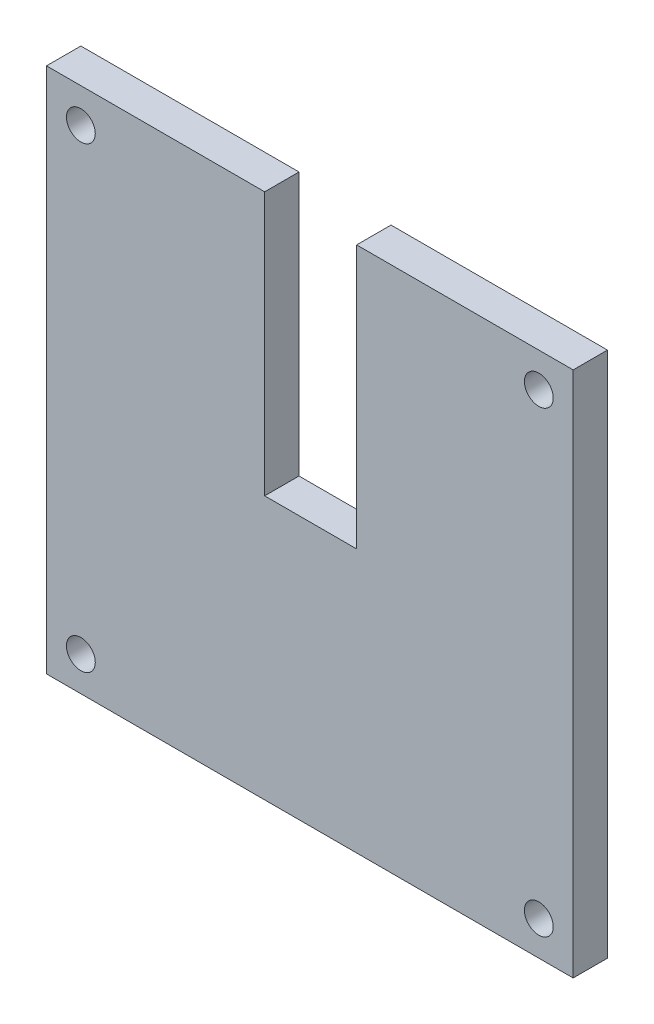
ISO-10303-21;
HEADER;
FILE_DESCRIPTION(('STEP AP214'),'2;1');
FILE_NAME('part.step','',(''),(''),'','','');
FILE_SCHEMA(('AUTOMOTIVE_DESIGN { 1 0 10303 214 1 1 1 1 }'));
ENDSEC;
DATA;
#1=APPLICATION_CONTEXT('core data for automotive mechanical design processes');
#2=APPLICATION_PROTOCOL_DEFINITION('international standard','automotive_design',2000,#1);
#3=PRODUCT_CONTEXT('',#1,'mechanical');
#4=PRODUCT('Part','Part','',(#3));
#5=PRODUCT_RELATED_PRODUCT_CATEGORY('part','',(#4));
#6=PRODUCT_DEFINITION_FORMATION('','',#4);
#7=PRODUCT_DEFINITION_CONTEXT('part definition',#1,'design');
#8=PRODUCT_DEFINITION('design','',#6,#7);
#9=PRODUCT_DEFINITION_SHAPE('','',#8);
#10=(LENGTH_UNIT() NAMED_UNIT(*) SI_UNIT(.MILLI.,.METRE.));
#11=(NAMED_UNIT(*) PLANE_ANGLE_UNIT() SI_UNIT($,.RADIAN.));
#12=(NAMED_UNIT(*) SI_UNIT($,.STERADIAN.) SOLID_ANGLE_UNIT());
#13=UNCERTAINTY_MEASURE_WITH_UNIT(LENGTH_MEASURE(1.E-05),#10,'distance_accuracy_value','');
#14=(GEOMETRIC_REPRESENTATION_CONTEXT(3) GLOBAL_UNCERTAINTY_ASSIGNED_CONTEXT((#13)) GLOBAL_UNIT_ASSIGNED_CONTEXT((#10,
#11,#12)) REPRESENTATION_CONTEXT('',''));
#15=CARTESIAN_POINT('',(0.,0.,0.));
#16=DIRECTION('',(0.,0.,1.));
#17=DIRECTION('',(1.,0.,0.));
#18=AXIS2_PLACEMENT_3D('',#15,#16,#17);
#19=CARTESIAN_POINT('',(29.21,29.21,3.81));
#20=DIRECTION('',(0.,-1.,0.));
#21=DIRECTION('',(1.,0.,0.));
#22=AXIS2_PLACEMENT_3D('',#19,#20,#21);
#23=PLANE('',#22);
#24=DIRECTION('',(-1.,0.,0.));
#25=VECTOR('',#24,1.);
#26=CARTESIAN_POINT('',(29.21,29.21,3.81));
#27=LINE('',#26,#25);
#28=CARTESIAN_POINT('',(-5.0091802723957,29.21,3.81));
#29=VERTEX_POINT('',#28);
#30=CARTESIAN_POINT('',(-29.21,29.21,3.81));
#31=VERTEX_POINT('',#30);
#32=EDGE_CURVE('E67',#29,#31,#27,.T.);
#33=ORIENTED_EDGE('',*,*,#32,.F.);
#34=DIRECTION('',(0.,0.,1.));
#35=VECTOR('',#34,1.);
#36=CARTESIAN_POINT('',(-5.0091802723957,29.21,0.));
#37=LINE('',#36,#35);
#38=CARTESIAN_POINT('',(-5.0091802723957,29.21,0.));
#39=VERTEX_POINT('',#38);
#40=EDGE_CURVE('E144',#39,#29,#37,.T.);
#41=ORIENTED_EDGE('',*,*,#40,.F.);
#42=DIRECTION('',(-1.,0.,0.));
#43=VECTOR('',#42,1.);
#44=CARTESIAN_POINT('',(29.21,29.21,0.));
#45=LINE('',#44,#43);
#46=CARTESIAN_POINT('',(-29.21,29.21,0.));
#47=VERTEX_POINT('',#46);
#48=EDGE_CURVE('E89',#39,#47,#45,.T.);
#49=ORIENTED_EDGE('',*,*,#48,.T.);
#50=DIRECTION('',(0.,0.,-1.));
#51=VECTOR('',#50,1.);
#52=CARTESIAN_POINT('',(-29.21,29.21,3.81));
#53=LINE('',#52,#51);
#54=EDGE_CURVE('E184',#31,#47,#53,.T.);
#55=ORIENTED_EDGE('',*,*,#54,.F.);
#56=EDGE_LOOP('',(#33,#41,#49,#55));
#57=FACE_BOUND('',#56,.T.);
#58=ADVANCED_FACE('F43',(#57),#23,.F.);
#59=CARTESIAN_POINT('',(-29.21,29.21,3.81));
#60=DIRECTION('',(1.,0.,0.));
#61=DIRECTION('',(0.,1.,0.));
#62=AXIS2_PLACEMENT_3D('',#59,#60,#61);
#63=PLANE('',#62);
#64=DIRECTION('',(0.,-1.,0.));
#65=VECTOR('',#64,1.);
#66=CARTESIAN_POINT('',(-29.21,29.21,0.));
#67=LINE('',#66,#65);
#68=CARTESIAN_POINT('',(-29.21,-29.21,0.));
#69=VERTEX_POINT('',#68);
#70=EDGE_CURVE('E172',#47,#69,#67,.T.);
#71=ORIENTED_EDGE('',*,*,#70,.T.);
#72=DIRECTION('',(0.,0.,-1.));
#73=VECTOR('',#72,1.);
#74=CARTESIAN_POINT('',(-29.21,-29.21,3.81));
#75=LINE('',#74,#73);
#76=CARTESIAN_POINT('',(-29.21,-29.21,3.81));
#77=VERTEX_POINT('',#76);
#78=EDGE_CURVE('E11',#77,#69,#75,.T.);
#79=ORIENTED_EDGE('',*,*,#78,.F.);
#80=DIRECTION('',(0.,-1.,0.));
#81=VECTOR('',#80,1.);
#82=CARTESIAN_POINT('',(-29.21,29.21,3.81));
#83=LINE('',#82,#81);
#84=EDGE_CURVE('E175',#31,#77,#83,.T.);
#85=ORIENTED_EDGE('',*,*,#84,.F.);
#86=ORIENTED_EDGE('',*,*,#54,.T.);
#87=EDGE_LOOP('',(#71,#79,#85,#86));
#88=FACE_BOUND('',#87,.T.);
#89=ADVANCED_FACE('F45',(#88),#63,.F.);
#90=CARTESIAN_POINT('',(29.21,-29.21,3.81));
#91=DIRECTION('',(0.,1.,0.));
#92=DIRECTION('',(0.,0.,1.));
#93=AXIS2_PLACEMENT_3D('',#90,#91,#92);
#94=PLANE('',#93);
#95=DIRECTION('',(1.,0.,0.));
#96=VECTOR('',#95,1.);
#97=CARTESIAN_POINT('',(29.21,-29.21,0.));
#98=LINE('',#97,#96);
#99=CARTESIAN_POINT('',(29.21,-29.21,0.));
#100=VERTEX_POINT('',#99);
#101=EDGE_CURVE('E187',#69,#100,#98,.T.);
#102=ORIENTED_EDGE('',*,*,#101,.T.);
#103=DIRECTION('',(0.,0.,-1.));
#104=VECTOR('',#103,1.);
#105=CARTESIAN_POINT('',(29.21,-29.21,3.81));
#106=LINE('',#105,#104);
#107=CARTESIAN_POINT('',(29.21,-29.21,3.81));
#108=VERTEX_POINT('',#107);
#109=EDGE_CURVE('E51',#108,#100,#106,.T.);
#110=ORIENTED_EDGE('',*,*,#109,.F.);
#111=DIRECTION('',(1.,0.,0.));
#112=VECTOR('',#111,1.);
#113=CARTESIAN_POINT('',(29.21,-29.21,3.81));
#114=LINE('',#113,#112);
#115=EDGE_CURVE('E96',#77,#108,#114,.T.);
#116=ORIENTED_EDGE('',*,*,#115,.F.);
#117=ORIENTED_EDGE('',*,*,#78,.T.);
#118=EDGE_LOOP('',(#102,#110,#116,#117));
#119=FACE_BOUND('',#118,.T.);
#120=ADVANCED_FACE('F211',(#119),#94,.F.);
#121=CARTESIAN_POINT('',(29.21,29.21,3.81));
#122=DIRECTION('',(-1.,0.,0.));
#123=DIRECTION('',(0.,-1.,0.));
#124=AXIS2_PLACEMENT_3D('',#121,#122,#123);
#125=PLANE('',#124);
#126=DIRECTION('',(0.,1.,0.));
#127=VECTOR('',#126,1.);
#128=CARTESIAN_POINT('',(29.21,29.21,0.));
#129=LINE('',#128,#127);
#130=CARTESIAN_POINT('',(29.21,29.21,0.));
#131=VERTEX_POINT('',#130);
#132=EDGE_CURVE('E189',#100,#131,#129,.T.);
#133=ORIENTED_EDGE('',*,*,#132,.T.);
#134=DIRECTION('',(0.,0.,-1.));
#135=VECTOR('',#134,1.);
#136=CARTESIAN_POINT('',(29.21,29.21,3.81));
#137=LINE('',#136,#135);
#138=CARTESIAN_POINT('',(29.21,29.21,3.81));
#139=VERTEX_POINT('',#138);
#140=EDGE_CURVE('E194',#139,#131,#137,.T.);
#141=ORIENTED_EDGE('',*,*,#140,.F.);
#142=DIRECTION('',(0.,1.,0.));
#143=VECTOR('',#142,1.);
#144=CARTESIAN_POINT('',(29.21,29.21,3.81));
#145=LINE('',#144,#143);
#146=EDGE_CURVE('E179',#108,#139,#145,.T.);
#147=ORIENTED_EDGE('',*,*,#146,.F.);
#148=ORIENTED_EDGE('',*,*,#109,.T.);
#149=EDGE_LOOP('',(#133,#141,#147,#148));
#150=FACE_BOUND('',#149,.T.);
#151=ADVANCED_FACE('F200',(#150),#125,.F.);
#152=CARTESIAN_POINT('',(5.19300340165794,29.21,0.));
#153=VERTEX_POINT('',#152);
#154=EDGE_CURVE('E177',#131,#153,#45,.T.);
#155=ORIENTED_EDGE('',*,*,#154,.T.);
#156=DIRECTION('',(0.,0.,1.));
#157=VECTOR('',#156,1.);
#158=CARTESIAN_POINT('',(5.19300340165794,29.21,0.));
#159=LINE('',#158,#157);
#160=CARTESIAN_POINT('',(5.19300340165794,29.21,3.81));
#161=VERTEX_POINT('',#160);
#162=EDGE_CURVE('E147',#153,#161,#159,.T.);
#163=ORIENTED_EDGE('',*,*,#162,.T.);
#164=EDGE_CURVE('E181',#139,#161,#27,.T.);
#165=ORIENTED_EDGE('',*,*,#164,.F.);
#166=ORIENTED_EDGE('',*,*,#140,.T.);
#167=EDGE_LOOP('',(#155,#163,#165,#166));
#168=FACE_BOUND('',#167,.T.);
#169=ADVANCED_FACE('F204',(#168),#23,.F.);
#170=CARTESIAN_POINT('',(0.,0.,3.81));
#171=DIRECTION('',(0.,0.,-1.));
#172=DIRECTION('',(-1.,0.,0.));
#173=AXIS2_PLACEMENT_3D('',#170,#171,#172);
#174=PLANE('',#173);
#175=CARTESIAN_POINT('',(25.4000006170508,25.4000006170507,3.81));
#176=DIRECTION('',(0.,0.,1.));
#177=DIRECTION('',(1.,0.,0.));
#178=AXIS2_PLACEMENT_3D('',#175,#176,#177);
#179=CIRCLE('',#178,1.6);
#180=CARTESIAN_POINT('',(27.0000006170508,25.4000006170507,3.81));
#181=VERTEX_POINT('',#180);
#182=EDGE_CURVE('E157',#181,#181,#179,.T.);
#183=ORIENTED_EDGE('',*,*,#182,.F.);
#184=EDGE_LOOP('',(#183));
#185=FACE_BOUND('',#184,.T.);
#186=CARTESIAN_POINT('',(-25.4000006170507,-25.4000006170507,3.81));
#187=DIRECTION('',(0.,0.,1.));
#188=DIRECTION('',(1.,0.,0.));
#189=AXIS2_PLACEMENT_3D('',#186,#187,#188);
#190=CIRCLE('',#189,1.6);
#191=CARTESIAN_POINT('',(-23.8000006170507,-25.4000006170507,3.81));
#192=VERTEX_POINT('',#191);
#193=EDGE_CURVE('E164',#192,#192,#190,.T.);
#194=ORIENTED_EDGE('',*,*,#193,.F.);
#195=EDGE_LOOP('',(#194));
#196=FACE_BOUND('',#195,.T.);
#197=CARTESIAN_POINT('',(25.4000006170507,-25.4000006170507,3.81));
#198=DIRECTION('',(0.,0.,1.));
#199=DIRECTION('',(1.,0.,0.));
#200=AXIS2_PLACEMENT_3D('',#197,#198,#199);
#201=CIRCLE('',#200,1.6);
#202=CARTESIAN_POINT('',(27.0000006170507,-25.4000006170507,3.81));
#203=VERTEX_POINT('',#202);
#204=EDGE_CURVE('E151',#203,#203,#201,.T.);
#205=ORIENTED_EDGE('',*,*,#204,.F.);
#206=EDGE_LOOP('',(#205));
#207=FACE_BOUND('',#206,.T.);
#208=CARTESIAN_POINT('',(-25.4000006170507,25.4000006170507,3.81));
#209=DIRECTION('',(0.,0.,1.));
#210=DIRECTION('',(1.,0.,0.));
#211=AXIS2_PLACEMENT_3D('',#208,#209,#210);
#212=CIRCLE('',#211,1.5999968);
#213=CARTESIAN_POINT('',(-23.8000038170507,25.4000006170507,3.81));
#214=VERTEX_POINT('',#213);
#215=EDGE_CURVE('E160',#214,#214,#212,.T.);
#216=ORIENTED_EDGE('',*,*,#215,.F.);
#217=EDGE_LOOP('',(#216));
#218=FACE_BOUND('',#217,.T.);
#219=DIRECTION('',(1.,0.,0.));
#220=VECTOR('',#219,1.);
#221=CARTESIAN_POINT('',(-5.00918027239569,0.,3.81));
#222=LINE('',#221,#220);
#223=CARTESIAN_POINT('',(-5.00918027239569,0.,3.81));
#224=VERTEX_POINT('',#223);
#225=CARTESIAN_POINT('',(5.19300340165794,0.,3.81));
#226=VERTEX_POINT('',#225);
#227=EDGE_CURVE('E138',#224,#226,#222,.T.);
#228=ORIENTED_EDGE('',*,*,#227,.F.);
#229=DIRECTION('',(0.,-1.,0.));
#230=VECTOR('',#229,1.);
#231=CARTESIAN_POINT('',(-5.0091802723957,29.21,3.81));
#232=LINE('',#231,#230);
#233=EDGE_CURVE('E122',#29,#224,#232,.T.);
#234=ORIENTED_EDGE('',*,*,#233,.F.);
#235=ORIENTED_EDGE('',*,*,#32,.T.);
#236=ORIENTED_EDGE('',*,*,#84,.T.);
#237=ORIENTED_EDGE('',*,*,#115,.T.);
#238=ORIENTED_EDGE('',*,*,#146,.T.);
#239=ORIENTED_EDGE('',*,*,#164,.T.);
#240=DIRECTION('',(0.,1.,0.));
#241=VECTOR('',#240,1.);
#242=CARTESIAN_POINT('',(5.19300340165794,29.21,3.81));
#243=LINE('',#242,#241);
#244=EDGE_CURVE('E136',#226,#161,#243,.T.);
#245=ORIENTED_EDGE('',*,*,#244,.F.);
#246=EDGE_LOOP('',(#228,#234,#235,#236,#237,#238,#239,#245));
#247=FACE_BOUND('',#246,.T.);
#248=ADVANCED_FACE('F207',(#185,#196,#207,#218,#247),#174,.F.);
#249=CARTESIAN_POINT('',(0.,0.,0.));
#250=DIRECTION('',(0.,0.,-1.));
#251=DIRECTION('',(-1.,0.,0.));
#252=AXIS2_PLACEMENT_3D('',#249,#250,#251);
#253=PLANE('',#252);
#254=DIRECTION('',(0.,-1.,0.));
#255=VECTOR('',#254,1.);
#256=CARTESIAN_POINT('',(-5.0091802723957,29.21,0.));
#257=LINE('',#256,#255);
#258=CARTESIAN_POINT('',(-5.00918027239569,0.,0.));
#259=VERTEX_POINT('',#258);
#260=EDGE_CURVE('E121',#39,#259,#257,.T.);
#261=ORIENTED_EDGE('',*,*,#260,.T.);
#262=DIRECTION('',(1.,0.,0.));
#263=VECTOR('',#262,1.);
#264=CARTESIAN_POINT('',(-5.00918027239569,0.,0.));
#265=LINE('',#264,#263);
#266=CARTESIAN_POINT('',(5.19300340165794,0.,0.));
#267=VERTEX_POINT('',#266);
#268=EDGE_CURVE('E129',#259,#267,#265,.T.);
#269=ORIENTED_EDGE('',*,*,#268,.T.);
#270=DIRECTION('',(0.,1.,0.));
#271=VECTOR('',#270,1.);
#272=CARTESIAN_POINT('',(5.19300340165794,29.21,0.));
#273=LINE('',#272,#271);
#274=EDGE_CURVE('E58',#267,#153,#273,.T.);
#275=ORIENTED_EDGE('',*,*,#274,.T.);
#276=ORIENTED_EDGE('',*,*,#154,.F.);
#277=ORIENTED_EDGE('',*,*,#132,.F.);
#278=ORIENTED_EDGE('',*,*,#101,.F.);
#279=ORIENTED_EDGE('',*,*,#70,.F.);
#280=ORIENTED_EDGE('',*,*,#48,.F.);
#281=EDGE_LOOP('',(#261,#269,#275,#276,#277,#278,#279,#280));
#282=FACE_BOUND('',#281,.T.);
#283=CARTESIAN_POINT('',(25.4000006170508,25.4000006170507,0.));
#284=DIRECTION('',(0.,0.,1.));
#285=DIRECTION('',(1.,0.,0.));
#286=AXIS2_PLACEMENT_3D('',#283,#284,#285);
#287=CIRCLE('',#286,1.6);
#288=CARTESIAN_POINT('',(27.0000006170508,25.4000006170507,0.));
#289=VERTEX_POINT('',#288);
#290=EDGE_CURVE('E161',#289,#289,#287,.T.);
#291=ORIENTED_EDGE('',*,*,#290,.T.);
#292=EDGE_LOOP('',(#291));
#293=FACE_BOUND('',#292,.T.);
#294=CARTESIAN_POINT('',(-25.4000006170507,-25.4000006170507,0.));
#295=DIRECTION('',(0.,0.,1.));
#296=DIRECTION('',(1.,0.,0.));
#297=AXIS2_PLACEMENT_3D('',#294,#295,#296);
#298=CIRCLE('',#297,1.6);
#299=CARTESIAN_POINT('',(-23.8000006170507,-25.4000006170507,0.));
#300=VERTEX_POINT('',#299);
#301=EDGE_CURVE('E154',#300,#300,#298,.T.);
#302=ORIENTED_EDGE('',*,*,#301,.T.);
#303=EDGE_LOOP('',(#302));
#304=FACE_BOUND('',#303,.T.);
#305=CARTESIAN_POINT('',(25.4000006170507,-25.4000006170507,0.));
#306=DIRECTION('',(0.,0.,1.));
#307=DIRECTION('',(1.,0.,0.));
#308=AXIS2_PLACEMENT_3D('',#305,#306,#307);
#309=CIRCLE('',#308,1.6);
#310=CARTESIAN_POINT('',(27.0000006170507,-25.4000006170507,0.));
#311=VERTEX_POINT('',#310);
#312=EDGE_CURVE('E146',#311,#311,#309,.T.);
#313=ORIENTED_EDGE('',*,*,#312,.T.);
#314=EDGE_LOOP('',(#313));
#315=FACE_BOUND('',#314,.T.);
#316=CARTESIAN_POINT('',(-25.4000006170507,25.4000006170507,0.));
#317=DIRECTION('',(0.,0.,1.));
#318=DIRECTION('',(1.,0.,0.));
#319=AXIS2_PLACEMENT_3D('',#316,#317,#318);
#320=CIRCLE('',#319,1.5999968);
#321=CARTESIAN_POINT('',(-23.8000038170507,25.4000006170507,0.));
#322=VERTEX_POINT('',#321);
#323=EDGE_CURVE('E169',#322,#322,#320,.T.);
#324=ORIENTED_EDGE('',*,*,#323,.T.);
#325=EDGE_LOOP('',(#324));
#326=FACE_BOUND('',#325,.T.);
#327=ADVANCED_FACE('F133',(#282,#293,#304,#315,#326),#253,.T.);
#328=CARTESIAN_POINT('',(-25.4000006170507,25.4000006170507,0.));
#329=DIRECTION('',(0.,0.,1.));
#330=DIRECTION('',(1.,0.,0.));
#331=AXIS2_PLACEMENT_3D('',#328,#329,#330);
#332=CYLINDRICAL_SURFACE('',#331,1.5999968);
#333=CARTESIAN_POINT('',(-23.8000038170507,25.4000006170507,0.));
#334=CARTESIAN_POINT('',(-23.8000038170507,25.4000006170507,0.0396874999999999));
#335=CARTESIAN_POINT('',(-23.8000038170507,25.4000006170507,0.079375));
#336=CARTESIAN_POINT('',(-23.8000038170507,25.4000006170507,0.15875));
#337=CARTESIAN_POINT('',(-23.8000038170507,25.4000006170507,0.1984375));
#338=CARTESIAN_POINT('',(-23.8000038170507,25.4000006170507,0.2778125));
#339=CARTESIAN_POINT('',(-23.8000038170507,25.4000006170507,0.3175));
#340=CARTESIAN_POINT('',(-23.8000038170507,25.4000006170507,0.396875));
#341=CARTESIAN_POINT('',(-23.8000038170507,25.4000006170507,0.4365625));
#342=CARTESIAN_POINT('',(-23.8000038170507,25.4000006170507,0.5159375));
#343=CARTESIAN_POINT('',(-23.8000038170507,25.4000006170507,0.555625));
#344=CARTESIAN_POINT('',(-23.8000038170507,25.4000006170507,0.635));
#345=CARTESIAN_POINT('',(-23.8000038170507,25.4000006170507,0.6746875));
#346=CARTESIAN_POINT('',(-23.8000038170507,25.4000006170507,0.7540625));
#347=CARTESIAN_POINT('',(-23.8000038170507,25.4000006170507,0.79375));
#348=CARTESIAN_POINT('',(-23.8000038170507,25.4000006170507,0.873125));
#349=CARTESIAN_POINT('',(-23.8000038170507,25.4000006170507,0.9128125));
#350=CARTESIAN_POINT('',(-23.8000038170507,25.4000006170507,0.9921875));
#351=CARTESIAN_POINT('',(-23.8000038170507,25.4000006170507,1.031875));
#352=CARTESIAN_POINT('',(-23.8000038170507,25.4000006170507,1.11125));
#353=CARTESIAN_POINT('',(-23.8000038170507,25.4000006170507,1.1509375));
#354=CARTESIAN_POINT('',(-23.8000038170507,25.4000006170507,1.2303125));
#355=CARTESIAN_POINT('',(-23.8000038170507,25.4000006170507,1.27));
#356=CARTESIAN_POINT('',(-23.8000038170507,25.4000006170507,1.349375));
#357=CARTESIAN_POINT('',(-23.8000038170507,25.4000006170507,1.3890625));
#358=CARTESIAN_POINT('',(-23.8000038170507,25.4000006170507,1.4684375));
#359=CARTESIAN_POINT('',(-23.8000038170507,25.4000006170507,1.508125));
#360=CARTESIAN_POINT('',(-23.8000038170507,25.4000006170507,1.5875));
#361=CARTESIAN_POINT('',(-23.8000038170507,25.4000006170507,1.6271875));
#362=CARTESIAN_POINT('',(-23.8000038170507,25.4000006170507,1.7065625));
#363=CARTESIAN_POINT('',(-23.8000038170507,25.4000006170507,1.74625));
#364=CARTESIAN_POINT('',(-23.8000038170507,25.4000006170507,1.825625));
#365=CARTESIAN_POINT('',(-23.8000038170507,25.4000006170507,1.8653125));
#366=CARTESIAN_POINT('',(-23.8000038170507,25.4000006170507,1.9446875));
#367=CARTESIAN_POINT('',(-23.8000038170507,25.4000006170507,1.984375));
#368=CARTESIAN_POINT('',(-23.8000038170507,25.4000006170507,2.06375));
#369=CARTESIAN_POINT('',(-23.8000038170507,25.4000006170507,2.1034375));
#370=CARTESIAN_POINT('',(-23.8000038170507,25.4000006170507,2.1828125));
#371=CARTESIAN_POINT('',(-23.8000038170507,25.4000006170507,2.2225));
#372=CARTESIAN_POINT('',(-23.8000038170507,25.4000006170507,2.301875));
#373=CARTESIAN_POINT('',(-23.8000038170507,25.4000006170507,2.3415625));
#374=CARTESIAN_POINT('',(-23.8000038170507,25.4000006170507,2.4209375));
#375=CARTESIAN_POINT('',(-23.8000038170507,25.4000006170507,2.460625));
#376=CARTESIAN_POINT('',(-23.8000038170507,25.4000006170507,2.54));
#377=CARTESIAN_POINT('',(-23.8000038170507,25.4000006170507,2.5796875));
#378=CARTESIAN_POINT('',(-23.8000038170507,25.4000006170507,2.6590625));
#379=CARTESIAN_POINT('',(-23.8000038170507,25.4000006170507,2.69875));
#380=CARTESIAN_POINT('',(-23.8000038170507,25.4000006170507,2.778125));
#381=CARTESIAN_POINT('',(-23.8000038170507,25.4000006170507,2.8178125));
#382=CARTESIAN_POINT('',(-23.8000038170507,25.4000006170507,2.8971875));
#383=CARTESIAN_POINT('',(-23.8000038170507,25.4000006170507,2.936875));
#384=CARTESIAN_POINT('',(-23.8000038170507,25.4000006170507,3.01625));
#385=CARTESIAN_POINT('',(-23.8000038170507,25.4000006170507,3.0559375));
#386=CARTESIAN_POINT('',(-23.8000038170507,25.4000006170507,3.1353125));
#387=CARTESIAN_POINT('',(-23.8000038170507,25.4000006170507,3.175));
#388=CARTESIAN_POINT('',(-23.8000038170507,25.4000006170507,3.254375));
#389=CARTESIAN_POINT('',(-23.8000038170507,25.4000006170507,3.2940625));
#390=CARTESIAN_POINT('',(-23.8000038170507,25.4000006170507,3.3734375));
#391=CARTESIAN_POINT('',(-23.8000038170507,25.4000006170507,3.413125));
#392=CARTESIAN_POINT('',(-23.8000038170507,25.4000006170507,3.4925));
#393=CARTESIAN_POINT('',(-23.8000038170507,25.4000006170507,3.5321875));
#394=CARTESIAN_POINT('',(-23.8000038170507,25.4000006170507,3.6115625));
#395=CARTESIAN_POINT('',(-23.8000038170507,25.4000006170507,3.65125));
#396=CARTESIAN_POINT('',(-23.8000038170507,25.4000006170507,3.730625));
#397=CARTESIAN_POINT('',(-23.8000038170507,25.4000006170507,3.7703125));
#398=CARTESIAN_POINT('',(-23.8000038170507,25.4000006170507,3.81));
#399=B_SPLINE_CURVE_WITH_KNOTS('',3,(#333,#334,#335,#336,#337,#338,#339,#340,#341,#342,#343,
#344,#345,#346,#347,#348,#349,#350,#351,#352,#353,#354,#355,#356,#357,#358,#359,#360,#361,#362,
#363,#364,#365,#366,#367,#368,#369,#370,#371,#372,#373,#374,#375,#376,#377,#378,#379,#380,#381,
#382,#383,#384,#385,#386,#387,#388,#389,#390,#391,#392,#393,#394,#395,#396,#397,#398),
.UNSPECIFIED.,.F.,.F.,(4,2,2,2,2,2,2,2,2,2,2,2,2,2,2,2,2,2,2,2,2,2,2,2,2,2,2,2,2,2,2,2,4),(0.,
0.1190625,0.238125,0.3571875,0.47625,0.5953125,0.714375,0.8334375,0.9525,1.0715625,1.190625,
1.3096875,1.42875,1.5478125,1.666875,1.7859375,1.905,2.0240625,2.143125,2.2621875,2.38125,
2.5003125,2.619375,2.7384375,2.8575,2.9765625,3.095625,3.2146875,3.33375,3.4528125,3.571875,
3.6909375,3.81),.UNSPECIFIED.);
#400=EDGE_CURVE('BSEAM233',#322,#214,#399,.T.);
#401=ORIENTED_EDGE('',*,*,#323,.F.);
#402=ORIENTED_EDGE('',*,*,#215,.T.);
#403=ORIENTED_EDGE('',*,*,#400,.T.);
#404=ORIENTED_EDGE('',*,*,#400,.F.);
#405=EDGE_LOOP('',(#401,#403,#402,#404));
#406=FACE_BOUND('',#405,.T.);
#407=ADVANCED_FACE('F233',(#406),#332,.F.);
#408=CARTESIAN_POINT('',(25.4000006170507,-25.4000006170507,0.));
#409=DIRECTION('',(0.,0.,1.));
#410=DIRECTION('',(1.,0.,0.));
#411=AXIS2_PLACEMENT_3D('',#408,#409,#410);
#412=CYLINDRICAL_SURFACE('',#411,1.6);
#413=CARTESIAN_POINT('',(27.0000006170507,-25.4000006170507,0.));
#414=CARTESIAN_POINT('',(27.0000006170507,-25.4000006170507,0.0396874999999999));
#415=CARTESIAN_POINT('',(27.0000006170507,-25.4000006170507,0.079375));
#416=CARTESIAN_POINT('',(27.0000006170507,-25.4000006170507,0.15875));
#417=CARTESIAN_POINT('',(27.0000006170507,-25.4000006170507,0.1984375));
#418=CARTESIAN_POINT('',(27.0000006170507,-25.4000006170507,0.2778125));
#419=CARTESIAN_POINT('',(27.0000006170507,-25.4000006170507,0.3175));
#420=CARTESIAN_POINT('',(27.0000006170507,-25.4000006170507,0.396875));
#421=CARTESIAN_POINT('',(27.0000006170507,-25.4000006170507,0.4365625));
#422=CARTESIAN_POINT('',(27.0000006170507,-25.4000006170507,0.5159375));
#423=CARTESIAN_POINT('',(27.0000006170507,-25.4000006170507,0.555625));
#424=CARTESIAN_POINT('',(27.0000006170507,-25.4000006170507,0.635));
#425=CARTESIAN_POINT('',(27.0000006170507,-25.4000006170507,0.6746875));
#426=CARTESIAN_POINT('',(27.0000006170507,-25.4000006170507,0.7540625));
#427=CARTESIAN_POINT('',(27.0000006170507,-25.4000006170507,0.79375));
#428=CARTESIAN_POINT('',(27.0000006170507,-25.4000006170507,0.873125));
#429=CARTESIAN_POINT('',(27.0000006170507,-25.4000006170507,0.9128125));
#430=CARTESIAN_POINT('',(27.0000006170507,-25.4000006170507,0.9921875));
#431=CARTESIAN_POINT('',(27.0000006170507,-25.4000006170507,1.031875));
#432=CARTESIAN_POINT('',(27.0000006170507,-25.4000006170507,1.11125));
#433=CARTESIAN_POINT('',(27.0000006170507,-25.4000006170507,1.1509375));
#434=CARTESIAN_POINT('',(27.0000006170507,-25.4000006170507,1.2303125));
#435=CARTESIAN_POINT('',(27.0000006170507,-25.4000006170507,1.27));
#436=CARTESIAN_POINT('',(27.0000006170507,-25.4000006170507,1.349375));
#437=CARTESIAN_POINT('',(27.0000006170507,-25.4000006170507,1.3890625));
#438=CARTESIAN_POINT('',(27.0000006170507,-25.4000006170507,1.4684375));
#439=CARTESIAN_POINT('',(27.0000006170507,-25.4000006170507,1.508125));
#440=CARTESIAN_POINT('',(27.0000006170507,-25.4000006170507,1.5875));
#441=CARTESIAN_POINT('',(27.0000006170507,-25.4000006170507,1.6271875));
#442=CARTESIAN_POINT('',(27.0000006170507,-25.4000006170507,1.7065625));
#443=CARTESIAN_POINT('',(27.0000006170507,-25.4000006170507,1.74625));
#444=CARTESIAN_POINT('',(27.0000006170507,-25.4000006170507,1.825625));
#445=CARTESIAN_POINT('',(27.0000006170507,-25.4000006170507,1.8653125));
#446=CARTESIAN_POINT('',(27.0000006170507,-25.4000006170507,1.9446875));
#447=CARTESIAN_POINT('',(27.0000006170507,-25.4000006170507,1.984375));
#448=CARTESIAN_POINT('',(27.0000006170507,-25.4000006170507,2.06375));
#449=CARTESIAN_POINT('',(27.0000006170507,-25.4000006170507,2.1034375));
#450=CARTESIAN_POINT('',(27.0000006170507,-25.4000006170507,2.1828125));
#451=CARTESIAN_POINT('',(27.0000006170507,-25.4000006170507,2.2225));
#452=CARTESIAN_POINT('',(27.0000006170507,-25.4000006170507,2.301875));
#453=CARTESIAN_POINT('',(27.0000006170507,-25.4000006170507,2.3415625));
#454=CARTESIAN_POINT('',(27.0000006170507,-25.4000006170507,2.4209375));
#455=CARTESIAN_POINT('',(27.0000006170507,-25.4000006170507,2.460625));
#456=CARTESIAN_POINT('',(27.0000006170507,-25.4000006170507,2.54));
#457=CARTESIAN_POINT('',(27.0000006170507,-25.4000006170507,2.5796875));
#458=CARTESIAN_POINT('',(27.0000006170507,-25.4000006170507,2.6590625));
#459=CARTESIAN_POINT('',(27.0000006170507,-25.4000006170507,2.69875));
#460=CARTESIAN_POINT('',(27.0000006170507,-25.4000006170507,2.778125));
#461=CARTESIAN_POINT('',(27.0000006170507,-25.4000006170507,2.8178125));
#462=CARTESIAN_POINT('',(27.0000006170507,-25.4000006170507,2.8971875));
#463=CARTESIAN_POINT('',(27.0000006170507,-25.4000006170507,2.936875));
#464=CARTESIAN_POINT('',(27.0000006170507,-25.4000006170507,3.01625));
#465=CARTESIAN_POINT('',(27.0000006170507,-25.4000006170507,3.0559375));
#466=CARTESIAN_POINT('',(27.0000006170507,-25.4000006170507,3.1353125));
#467=CARTESIAN_POINT('',(27.0000006170507,-25.4000006170507,3.175));
#468=CARTESIAN_POINT('',(27.0000006170507,-25.4000006170507,3.254375));
#469=CARTESIAN_POINT('',(27.0000006170507,-25.4000006170507,3.2940625));
#470=CARTESIAN_POINT('',(27.0000006170507,-25.4000006170507,3.3734375));
#471=CARTESIAN_POINT('',(27.0000006170507,-25.4000006170507,3.413125));
#472=CARTESIAN_POINT('',(27.0000006170507,-25.4000006170507,3.4925));
#473=CARTESIAN_POINT('',(27.0000006170507,-25.4000006170507,3.5321875));
#474=CARTESIAN_POINT('',(27.0000006170507,-25.4000006170507,3.6115625));
#475=CARTESIAN_POINT('',(27.0000006170507,-25.4000006170507,3.65125));
#476=CARTESIAN_POINT('',(27.0000006170507,-25.4000006170507,3.730625));
#477=CARTESIAN_POINT('',(27.0000006170507,-25.4000006170507,3.7703125));
#478=CARTESIAN_POINT('',(27.0000006170507,-25.4000006170507,3.81));
#479=B_SPLINE_CURVE_WITH_KNOTS('',3,(#413,#414,#415,#416,#417,#418,#419,#420,#421,#422,#423,
#424,#425,#426,#427,#428,#429,#430,#431,#432,#433,#434,#435,#436,#437,#438,#439,#440,#441,#442,
#443,#444,#445,#446,#447,#448,#449,#450,#451,#452,#453,#454,#455,#456,#457,#458,#459,#460,#461,
#462,#463,#464,#465,#466,#467,#468,#469,#470,#471,#472,#473,#474,#475,#476,#477,#478),
.UNSPECIFIED.,.F.,.F.,(4,2,2,2,2,2,2,2,2,2,2,2,2,2,2,2,2,2,2,2,2,2,2,2,2,2,2,2,2,2,2,2,4),(0.,
0.1190625,0.238125,0.3571875,0.47625,0.5953125,0.714375,0.8334375,0.9525,1.0715625,1.190625,
1.3096875,1.42875,1.5478125,1.666875,1.7859375,1.905,2.0240625,2.143125,2.2621875,2.38125,
2.5003125,2.619375,2.7384375,2.8575,2.9765625,3.095625,3.2146875,3.33375,3.4528125,3.571875,
3.6909375,3.81),.UNSPECIFIED.);
#480=EDGE_CURVE('BSEAM239',#311,#203,#479,.T.);
#481=ORIENTED_EDGE('',*,*,#312,.F.);
#482=ORIENTED_EDGE('',*,*,#204,.T.);
#483=ORIENTED_EDGE('',*,*,#480,.T.);
#484=ORIENTED_EDGE('',*,*,#480,.F.);
#485=EDGE_LOOP('',(#481,#483,#482,#484));
#486=FACE_BOUND('',#485,.T.);
#487=ADVANCED_FACE('F239',(#486),#412,.F.);
#488=CARTESIAN_POINT('',(-25.4000006170507,-25.4000006170507,0.));
#489=DIRECTION('',(0.,0.,1.));
#490=DIRECTION('',(1.,0.,0.));
#491=AXIS2_PLACEMENT_3D('',#488,#489,#490);
#492=CYLINDRICAL_SURFACE('',#491,1.6);
#493=CARTESIAN_POINT('',(-23.8000006170507,-25.4000006170507,0.));
#494=CARTESIAN_POINT('',(-23.8000006170507,-25.4000006170507,0.0396874999999999));
#495=CARTESIAN_POINT('',(-23.8000006170507,-25.4000006170507,0.079375));
#496=CARTESIAN_POINT('',(-23.8000006170507,-25.4000006170507,0.15875));
#497=CARTESIAN_POINT('',(-23.8000006170507,-25.4000006170507,0.1984375));
#498=CARTESIAN_POINT('',(-23.8000006170507,-25.4000006170507,0.2778125));
#499=CARTESIAN_POINT('',(-23.8000006170507,-25.4000006170507,0.3175));
#500=CARTESIAN_POINT('',(-23.8000006170507,-25.4000006170507,0.396875));
#501=CARTESIAN_POINT('',(-23.8000006170507,-25.4000006170507,0.4365625));
#502=CARTESIAN_POINT('',(-23.8000006170507,-25.4000006170507,0.5159375));
#503=CARTESIAN_POINT('',(-23.8000006170507,-25.4000006170507,0.555625));
#504=CARTESIAN_POINT('',(-23.8000006170507,-25.4000006170507,0.635));
#505=CARTESIAN_POINT('',(-23.8000006170507,-25.4000006170507,0.6746875));
#506=CARTESIAN_POINT('',(-23.8000006170507,-25.4000006170507,0.7540625));
#507=CARTESIAN_POINT('',(-23.8000006170507,-25.4000006170507,0.79375));
#508=CARTESIAN_POINT('',(-23.8000006170507,-25.4000006170507,0.873125));
#509=CARTESIAN_POINT('',(-23.8000006170507,-25.4000006170507,0.9128125));
#510=CARTESIAN_POINT('',(-23.8000006170507,-25.4000006170507,0.9921875));
#511=CARTESIAN_POINT('',(-23.8000006170507,-25.4000006170507,1.031875));
#512=CARTESIAN_POINT('',(-23.8000006170507,-25.4000006170507,1.11125));
#513=CARTESIAN_POINT('',(-23.8000006170507,-25.4000006170507,1.1509375));
#514=CARTESIAN_POINT('',(-23.8000006170507,-25.4000006170507,1.2303125));
#515=CARTESIAN_POINT('',(-23.8000006170507,-25.4000006170507,1.27));
#516=CARTESIAN_POINT('',(-23.8000006170507,-25.4000006170507,1.349375));
#517=CARTESIAN_POINT('',(-23.8000006170507,-25.4000006170507,1.3890625));
#518=CARTESIAN_POINT('',(-23.8000006170507,-25.4000006170507,1.4684375));
#519=CARTESIAN_POINT('',(-23.8000006170507,-25.4000006170507,1.508125));
#520=CARTESIAN_POINT('',(-23.8000006170507,-25.4000006170507,1.5875));
#521=CARTESIAN_POINT('',(-23.8000006170507,-25.4000006170507,1.6271875));
#522=CARTESIAN_POINT('',(-23.8000006170507,-25.4000006170507,1.7065625));
#523=CARTESIAN_POINT('',(-23.8000006170507,-25.4000006170507,1.74625));
#524=CARTESIAN_POINT('',(-23.8000006170507,-25.4000006170507,1.825625));
#525=CARTESIAN_POINT('',(-23.8000006170507,-25.4000006170507,1.8653125));
#526=CARTESIAN_POINT('',(-23.8000006170507,-25.4000006170507,1.9446875));
#527=CARTESIAN_POINT('',(-23.8000006170507,-25.4000006170507,1.984375));
#528=CARTESIAN_POINT('',(-23.8000006170507,-25.4000006170507,2.06375));
#529=CARTESIAN_POINT('',(-23.8000006170507,-25.4000006170507,2.1034375));
#530=CARTESIAN_POINT('',(-23.8000006170507,-25.4000006170507,2.1828125));
#531=CARTESIAN_POINT('',(-23.8000006170507,-25.4000006170507,2.2225));
#532=CARTESIAN_POINT('',(-23.8000006170507,-25.4000006170507,2.301875));
#533=CARTESIAN_POINT('',(-23.8000006170507,-25.4000006170507,2.3415625));
#534=CARTESIAN_POINT('',(-23.8000006170507,-25.4000006170507,2.4209375));
#535=CARTESIAN_POINT('',(-23.8000006170507,-25.4000006170507,2.460625));
#536=CARTESIAN_POINT('',(-23.8000006170507,-25.4000006170507,2.54));
#537=CARTESIAN_POINT('',(-23.8000006170507,-25.4000006170507,2.5796875));
#538=CARTESIAN_POINT('',(-23.8000006170507,-25.4000006170507,2.6590625));
#539=CARTESIAN_POINT('',(-23.8000006170507,-25.4000006170507,2.69875));
#540=CARTESIAN_POINT('',(-23.8000006170507,-25.4000006170507,2.778125));
#541=CARTESIAN_POINT('',(-23.8000006170507,-25.4000006170507,2.8178125));
#542=CARTESIAN_POINT('',(-23.8000006170507,-25.4000006170507,2.8971875));
#543=CARTESIAN_POINT('',(-23.8000006170507,-25.4000006170507,2.936875));
#544=CARTESIAN_POINT('',(-23.8000006170507,-25.4000006170507,3.01625));
#545=CARTESIAN_POINT('',(-23.8000006170507,-25.4000006170507,3.0559375));
#546=CARTESIAN_POINT('',(-23.8000006170507,-25.4000006170507,3.1353125));
#547=CARTESIAN_POINT('',(-23.8000006170507,-25.4000006170507,3.175));
#548=CARTESIAN_POINT('',(-23.8000006170507,-25.4000006170507,3.254375));
#549=CARTESIAN_POINT('',(-23.8000006170507,-25.4000006170507,3.2940625));
#550=CARTESIAN_POINT('',(-23.8000006170507,-25.4000006170507,3.3734375));
#551=CARTESIAN_POINT('',(-23.8000006170507,-25.4000006170507,3.413125));
#552=CARTESIAN_POINT('',(-23.8000006170507,-25.4000006170507,3.4925));
#553=CARTESIAN_POINT('',(-23.8000006170507,-25.4000006170507,3.5321875));
#554=CARTESIAN_POINT('',(-23.8000006170507,-25.4000006170507,3.6115625));
#555=CARTESIAN_POINT('',(-23.8000006170507,-25.4000006170507,3.65125));
#556=CARTESIAN_POINT('',(-23.8000006170507,-25.4000006170507,3.730625));
#557=CARTESIAN_POINT('',(-23.8000006170507,-25.4000006170507,3.7703125));
#558=CARTESIAN_POINT('',(-23.8000006170507,-25.4000006170507,3.81));
#559=B_SPLINE_CURVE_WITH_KNOTS('',3,(#493,#494,#495,#496,#497,#498,#499,#500,#501,#502,#503,
#504,#505,#506,#507,#508,#509,#510,#511,#512,#513,#514,#515,#516,#517,#518,#519,#520,#521,#522,
#523,#524,#525,#526,#527,#528,#529,#530,#531,#532,#533,#534,#535,#536,#537,#538,#539,#540,#541,
#542,#543,#544,#545,#546,#547,#548,#549,#550,#551,#552,#553,#554,#555,#556,#557,#558),
.UNSPECIFIED.,.F.,.F.,(4,2,2,2,2,2,2,2,2,2,2,2,2,2,2,2,2,2,2,2,2,2,2,2,2,2,2,2,2,2,2,2,4),(0.,
0.1190625,0.238125,0.3571875,0.47625,0.5953125,0.714375,0.8334375,0.9525,1.0715625,1.190625,
1.3096875,1.42875,1.5478125,1.666875,1.7859375,1.905,2.0240625,2.143125,2.2621875,2.38125,
2.5003125,2.619375,2.7384375,2.8575,2.9765625,3.095625,3.2146875,3.33375,3.4528125,3.571875,
3.6909375,3.81),.UNSPECIFIED.);
#560=EDGE_CURVE('BSEAM241',#300,#192,#559,.T.);
#561=ORIENTED_EDGE('',*,*,#301,.F.);
#562=ORIENTED_EDGE('',*,*,#193,.T.);
#563=ORIENTED_EDGE('',*,*,#560,.T.);
#564=ORIENTED_EDGE('',*,*,#560,.F.);
#565=EDGE_LOOP('',(#561,#563,#562,#564));
#566=FACE_BOUND('',#565,.T.);
#567=ADVANCED_FACE('F241',(#566),#492,.F.);
#568=CARTESIAN_POINT('',(25.4000006170508,25.4000006170507,0.));
#569=DIRECTION('',(0.,0.,1.));
#570=DIRECTION('',(1.,0.,0.));
#571=AXIS2_PLACEMENT_3D('',#568,#569,#570);
#572=CYLINDRICAL_SURFACE('',#571,1.6);
#573=CARTESIAN_POINT('',(27.0000006170508,25.4000006170507,0.));
#574=CARTESIAN_POINT('',(27.0000006170508,25.4000006170507,0.0396874999999999));
#575=CARTESIAN_POINT('',(27.0000006170508,25.4000006170507,0.079375));
#576=CARTESIAN_POINT('',(27.0000006170508,25.4000006170507,0.15875));
#577=CARTESIAN_POINT('',(27.0000006170508,25.4000006170507,0.1984375));
#578=CARTESIAN_POINT('',(27.0000006170508,25.4000006170507,0.2778125));
#579=CARTESIAN_POINT('',(27.0000006170508,25.4000006170507,0.3175));
#580=CARTESIAN_POINT('',(27.0000006170508,25.4000006170507,0.396875));
#581=CARTESIAN_POINT('',(27.0000006170508,25.4000006170507,0.4365625));
#582=CARTESIAN_POINT('',(27.0000006170508,25.4000006170507,0.5159375));
#583=CARTESIAN_POINT('',(27.0000006170508,25.4000006170507,0.555625));
#584=CARTESIAN_POINT('',(27.0000006170508,25.4000006170507,0.635));
#585=CARTESIAN_POINT('',(27.0000006170508,25.4000006170507,0.6746875));
#586=CARTESIAN_POINT('',(27.0000006170508,25.4000006170507,0.7540625));
#587=CARTESIAN_POINT('',(27.0000006170508,25.4000006170507,0.79375));
#588=CARTESIAN_POINT('',(27.0000006170508,25.4000006170507,0.873125));
#589=CARTESIAN_POINT('',(27.0000006170508,25.4000006170507,0.9128125));
#590=CARTESIAN_POINT('',(27.0000006170508,25.4000006170507,0.9921875));
#591=CARTESIAN_POINT('',(27.0000006170508,25.4000006170507,1.031875));
#592=CARTESIAN_POINT('',(27.0000006170508,25.4000006170507,1.11125));
#593=CARTESIAN_POINT('',(27.0000006170508,25.4000006170507,1.1509375));
#594=CARTESIAN_POINT('',(27.0000006170508,25.4000006170507,1.2303125));
#595=CARTESIAN_POINT('',(27.0000006170508,25.4000006170507,1.27));
#596=CARTESIAN_POINT('',(27.0000006170508,25.4000006170507,1.349375));
#597=CARTESIAN_POINT('',(27.0000006170508,25.4000006170507,1.3890625));
#598=CARTESIAN_POINT('',(27.0000006170508,25.4000006170507,1.4684375));
#599=CARTESIAN_POINT('',(27.0000006170508,25.4000006170507,1.508125));
#600=CARTESIAN_POINT('',(27.0000006170508,25.4000006170507,1.5875));
#601=CARTESIAN_POINT('',(27.0000006170508,25.4000006170507,1.6271875));
#602=CARTESIAN_POINT('',(27.0000006170508,25.4000006170507,1.7065625));
#603=CARTESIAN_POINT('',(27.0000006170508,25.4000006170507,1.74625));
#604=CARTESIAN_POINT('',(27.0000006170508,25.4000006170507,1.825625));
#605=CARTESIAN_POINT('',(27.0000006170508,25.4000006170507,1.8653125));
#606=CARTESIAN_POINT('',(27.0000006170508,25.4000006170507,1.9446875));
#607=CARTESIAN_POINT('',(27.0000006170508,25.4000006170507,1.984375));
#608=CARTESIAN_POINT('',(27.0000006170508,25.4000006170507,2.06375));
#609=CARTESIAN_POINT('',(27.0000006170508,25.4000006170507,2.1034375));
#610=CARTESIAN_POINT('',(27.0000006170508,25.4000006170507,2.1828125));
#611=CARTESIAN_POINT('',(27.0000006170508,25.4000006170507,2.2225));
#612=CARTESIAN_POINT('',(27.0000006170508,25.4000006170507,2.301875));
#613=CARTESIAN_POINT('',(27.0000006170508,25.4000006170507,2.3415625));
#614=CARTESIAN_POINT('',(27.0000006170508,25.4000006170507,2.4209375));
#615=CARTESIAN_POINT('',(27.0000006170508,25.4000006170507,2.460625));
#616=CARTESIAN_POINT('',(27.0000006170508,25.4000006170507,2.54));
#617=CARTESIAN_POINT('',(27.0000006170508,25.4000006170507,2.5796875));
#618=CARTESIAN_POINT('',(27.0000006170508,25.4000006170507,2.6590625));
#619=CARTESIAN_POINT('',(27.0000006170508,25.4000006170507,2.69875));
#620=CARTESIAN_POINT('',(27.0000006170508,25.4000006170507,2.778125));
#621=CARTESIAN_POINT('',(27.0000006170508,25.4000006170507,2.8178125));
#622=CARTESIAN_POINT('',(27.0000006170508,25.4000006170507,2.8971875));
#623=CARTESIAN_POINT('',(27.0000006170508,25.4000006170507,2.936875));
#624=CARTESIAN_POINT('',(27.0000006170508,25.4000006170507,3.01625));
#625=CARTESIAN_POINT('',(27.0000006170508,25.4000006170507,3.0559375));
#626=CARTESIAN_POINT('',(27.0000006170508,25.4000006170507,3.1353125));
#627=CARTESIAN_POINT('',(27.0000006170508,25.4000006170507,3.175));
#628=CARTESIAN_POINT('',(27.0000006170508,25.4000006170507,3.254375));
#629=CARTESIAN_POINT('',(27.0000006170508,25.4000006170507,3.2940625));
#630=CARTESIAN_POINT('',(27.0000006170508,25.4000006170507,3.3734375));
#631=CARTESIAN_POINT('',(27.0000006170508,25.4000006170507,3.413125));
#632=CARTESIAN_POINT('',(27.0000006170508,25.4000006170507,3.4925));
#633=CARTESIAN_POINT('',(27.0000006170508,25.4000006170507,3.5321875));
#634=CARTESIAN_POINT('',(27.0000006170508,25.4000006170507,3.6115625));
#635=CARTESIAN_POINT('',(27.0000006170508,25.4000006170507,3.65125));
#636=CARTESIAN_POINT('',(27.0000006170508,25.4000006170507,3.730625));
#637=CARTESIAN_POINT('',(27.0000006170508,25.4000006170507,3.7703125));
#638=CARTESIAN_POINT('',(27.0000006170508,25.4000006170507,3.81));
#639=B_SPLINE_CURVE_WITH_KNOTS('',3,(#573,#574,#575,#576,#577,#578,#579,#580,#581,#582,#583,
#584,#585,#586,#587,#588,#589,#590,#591,#592,#593,#594,#595,#596,#597,#598,#599,#600,#601,#602,
#603,#604,#605,#606,#607,#608,#609,#610,#611,#612,#613,#614,#615,#616,#617,#618,#619,#620,#621,
#622,#623,#624,#625,#626,#627,#628,#629,#630,#631,#632,#633,#634,#635,#636,#637,#638),
.UNSPECIFIED.,.F.,.F.,(4,2,2,2,2,2,2,2,2,2,2,2,2,2,2,2,2,2,2,2,2,2,2,2,2,2,2,2,2,2,2,2,4),(0.,
0.1190625,0.238125,0.3571875,0.47625,0.5953125,0.714375,0.8334375,0.9525,1.0715625,1.190625,
1.3096875,1.42875,1.5478125,1.666875,1.7859375,1.905,2.0240625,2.143125,2.2621875,2.38125,
2.5003125,2.619375,2.7384375,2.8575,2.9765625,3.095625,3.2146875,3.33375,3.4528125,3.571875,
3.6909375,3.81),.UNSPECIFIED.);
#640=EDGE_CURVE('BSEAM244',#289,#181,#639,.T.);
#641=ORIENTED_EDGE('',*,*,#290,.F.);
#642=ORIENTED_EDGE('',*,*,#182,.T.);
#643=ORIENTED_EDGE('',*,*,#640,.T.);
#644=ORIENTED_EDGE('',*,*,#640,.F.);
#645=EDGE_LOOP('',(#641,#643,#642,#644));
#646=FACE_BOUND('',#645,.T.);
#647=ADVANCED_FACE('F244',(#646),#572,.F.);
#648=CARTESIAN_POINT('',(-5.0091802723957,29.21,0.));
#649=DIRECTION('',(-1.,0.,0.));
#650=DIRECTION('',(0.,-1.,0.));
#651=AXIS2_PLACEMENT_3D('',#648,#649,#650);
#652=PLANE('',#651);
#653=ORIENTED_EDGE('',*,*,#233,.T.);
#654=DIRECTION('',(0.,0.,1.));
#655=VECTOR('',#654,1.);
#656=CARTESIAN_POINT('',(-5.00918027239569,0.,0.));
#657=LINE('',#656,#655);
#658=EDGE_CURVE('E117',#259,#224,#657,.T.);
#659=ORIENTED_EDGE('',*,*,#658,.F.);
#660=ORIENTED_EDGE('',*,*,#260,.F.);
#661=ORIENTED_EDGE('',*,*,#40,.T.);
#662=EDGE_LOOP('',(#653,#659,#660,#661));
#663=FACE_BOUND('',#662,.T.);
#664=ADVANCED_FACE('F119',(#663),#652,.F.);
#665=CARTESIAN_POINT('',(5.19300340165794,29.21,0.));
#666=DIRECTION('',(1.,0.,0.));
#667=DIRECTION('',(0.,1.,0.));
#668=AXIS2_PLACEMENT_3D('',#665,#666,#667);
#669=PLANE('',#668);
#670=ORIENTED_EDGE('',*,*,#244,.T.);
#671=ORIENTED_EDGE('',*,*,#162,.F.);
#672=ORIENTED_EDGE('',*,*,#274,.F.);
#673=DIRECTION('',(0.,0.,1.));
#674=VECTOR('',#673,1.);
#675=CARTESIAN_POINT('',(5.19300340165794,0.,0.));
#676=LINE('',#675,#674);
#677=EDGE_CURVE('E126',#267,#226,#676,.T.);
#678=ORIENTED_EDGE('',*,*,#677,.T.);
#679=EDGE_LOOP('',(#670,#671,#672,#678));
#680=FACE_BOUND('',#679,.T.);
#681=ADVANCED_FACE('F253',(#680),#669,.F.);
#682=CARTESIAN_POINT('',(-5.00918027239569,0.,0.));
#683=DIRECTION('',(0.,-1.,0.));
#684=DIRECTION('',(0.,0.,-1.));
#685=AXIS2_PLACEMENT_3D('',#682,#683,#684);
#686=PLANE('',#685);
#687=ORIENTED_EDGE('',*,*,#227,.T.);
#688=ORIENTED_EDGE('',*,*,#677,.F.);
#689=ORIENTED_EDGE('',*,*,#268,.F.);
#690=ORIENTED_EDGE('',*,*,#658,.T.);
#691=EDGE_LOOP('',(#687,#688,#689,#690));
#692=FACE_BOUND('',#691,.T.);
#693=ADVANCED_FACE('F130',(#692),#686,.F.);
#694=CLOSED_SHELL('',(#58,#89,#120,#151,#169,#248,#327,#407,#487,#567,#647,#664,#681,#693));
#695=MANIFOLD_SOLID_BREP('B2',#694);
#696=ADVANCED_BREP_SHAPE_REPRESENTATION('',(#18,#695),#14);
#697=SHAPE_DEFINITION_REPRESENTATION(#9,#696);
ENDSEC;
END-ISO-10303-21;
